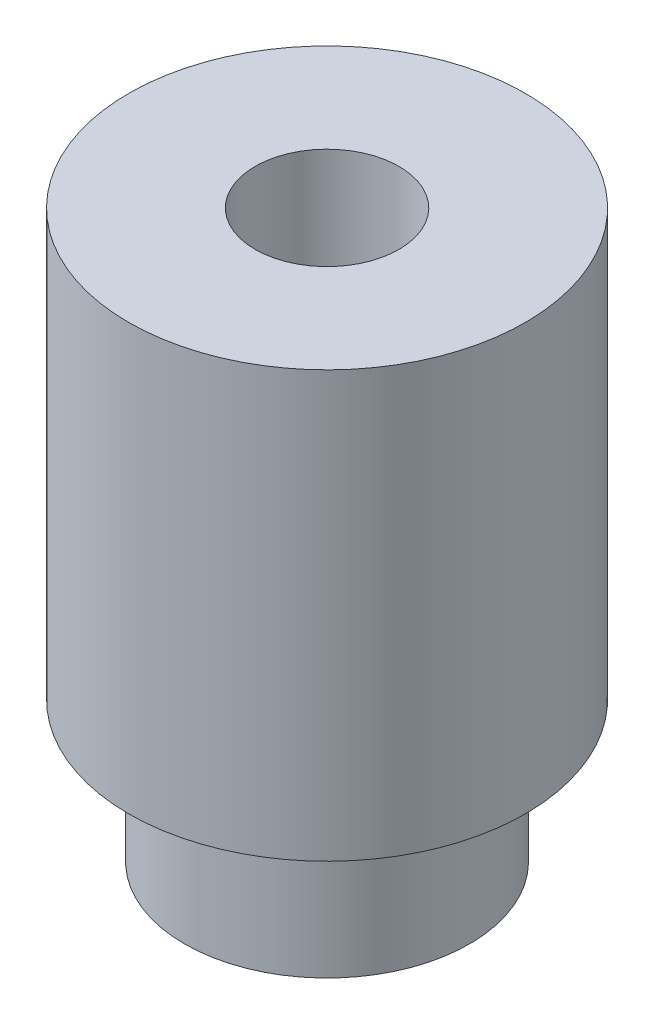
ISO-10303-21;
HEADER;
FILE_DESCRIPTION(('STEP AP214'),'2;1');
FILE_NAME('part.step','',(''),(''),'','','');
FILE_SCHEMA(('AUTOMOTIVE_DESIGN { 1 0 10303 214 1 1 1 1 }'));
ENDSEC;
DATA;
#1=APPLICATION_CONTEXT('core data for automotive mechanical design processes');
#2=APPLICATION_PROTOCOL_DEFINITION('international standard','automotive_design',2000,#1);
#3=PRODUCT_CONTEXT('',#1,'mechanical');
#4=PRODUCT('Part','Part','',(#3));
#5=PRODUCT_RELATED_PRODUCT_CATEGORY('part','',(#4));
#6=PRODUCT_DEFINITION_FORMATION('','',#4);
#7=PRODUCT_DEFINITION_CONTEXT('part definition',#1,'design');
#8=PRODUCT_DEFINITION('design','',#6,#7);
#9=PRODUCT_DEFINITION_SHAPE('','',#8);
#10=(LENGTH_UNIT() NAMED_UNIT(*) SI_UNIT(.MILLI.,.METRE.));
#11=(NAMED_UNIT(*) PLANE_ANGLE_UNIT() SI_UNIT($,.RADIAN.));
#12=(NAMED_UNIT(*) SI_UNIT($,.STERADIAN.) SOLID_ANGLE_UNIT());
#13=UNCERTAINTY_MEASURE_WITH_UNIT(LENGTH_MEASURE(1.E-05),#10,'distance_accuracy_value','');
#14=(GEOMETRIC_REPRESENTATION_CONTEXT(3) GLOBAL_UNCERTAINTY_ASSIGNED_CONTEXT((#13)) GLOBAL_UNIT_ASSIGNED_CONTEXT((#10,
#11,#12)) REPRESENTATION_CONTEXT('',''));
#15=CARTESIAN_POINT('',(0.,0.,0.));
#16=DIRECTION('',(0.,0.,1.));
#17=DIRECTION('',(1.,0.,0.));
#18=AXIS2_PLACEMENT_3D('',#15,#16,#17);
#19=CARTESIAN_POINT('',(0.,9.906,0.));
#20=DIRECTION('',(0.,-1.,0.));
#21=DIRECTION('',(0.,0.,-1.));
#22=AXIS2_PLACEMENT_3D('',#19,#20,#21);
#23=CYLINDRICAL_SURFACE('',#22,10.033);
#24=CARTESIAN_POINT('',(0.,9.906,0.));
#25=DIRECTION('',(0.,1.,0.));
#26=DIRECTION('',(0.,0.,1.));
#27=AXIS2_PLACEMENT_3D('',#24,#25,#26);
#28=CIRCLE('',#27,10.033);
#29=CARTESIAN_POINT('',(0.,9.906,10.033));
#30=VERTEX_POINT('',#29);
#31=EDGE_CURVE('E10',#30,#30,#28,.T.);
#32=ORIENTED_EDGE('',*,*,#31,.F.);
#33=EDGE_LOOP('',(#32));
#34=FACE_BOUND('',#33,.T.);
#35=CARTESIAN_POINT('',(0.,0.,0.));
#36=DIRECTION('',(0.,1.,0.));
#37=DIRECTION('',(0.,0.,1.));
#38=AXIS2_PLACEMENT_3D('',#35,#36,#37);
#39=CIRCLE('',#38,10.033);
#40=CARTESIAN_POINT('',(0.,0.,10.033));
#41=VERTEX_POINT('',#40);
#42=EDGE_CURVE('E43',#41,#41,#39,.T.);
#43=ORIENTED_EDGE('',*,*,#42,.T.);
#44=EDGE_LOOP('',(#43));
#45=FACE_BOUND('',#44,.T.);
#46=ADVANCED_FACE('F40',(#34,#45),#23,.T.);
#47=CARTESIAN_POINT('',(0.,0.,0.));
#48=DIRECTION('',(0.,1.,0.));
#49=DIRECTION('',(0.,0.,1.));
#50=AXIS2_PLACEMENT_3D('',#47,#48,#49);
#51=PLANE('',#50);
#52=CARTESIAN_POINT('',(0.,0.,0.));
#53=DIRECTION('',(0.,1.,0.));
#54=DIRECTION('',(0.,0.,1.));
#55=AXIS2_PLACEMENT_3D('',#52,#53,#54);
#56=CIRCLE('',#55,5.0673);
#57=CARTESIAN_POINT('',(0.,0.,5.0673));
#58=VERTEX_POINT('',#57);
#59=EDGE_CURVE('E55',#58,#58,#56,.T.);
#60=ORIENTED_EDGE('',*,*,#59,.T.);
#61=EDGE_LOOP('',(#60));
#62=FACE_BOUND('',#61,.T.);
#63=ORIENTED_EDGE('',*,*,#42,.F.);
#64=EDGE_LOOP('',(#63));
#65=FACE_BOUND('',#64,.T.);
#66=ADVANCED_FACE('F64',(#62,#65),#51,.F.);
#67=CARTESIAN_POINT('',(0.,39.878,0.));
#68=DIRECTION('',(0.,-1.,0.));
#69=DIRECTION('',(0.,0.,-1.));
#70=AXIS2_PLACEMENT_3D('',#67,#68,#69);
#71=CYLINDRICAL_SURFACE('',#70,13.97);
#72=CARTESIAN_POINT('',(0.,39.878,0.));
#73=DIRECTION('',(0.,1.,0.));
#74=DIRECTION('',(0.,0.,1.));
#75=AXIS2_PLACEMENT_3D('',#72,#73,#74);
#76=CIRCLE('',#75,13.97);
#77=CARTESIAN_POINT('',(0.,39.878,13.97));
#78=VERTEX_POINT('',#77);
#79=EDGE_CURVE('E50',#78,#78,#76,.T.);
#80=ORIENTED_EDGE('',*,*,#79,.F.);
#81=EDGE_LOOP('',(#80));
#82=FACE_BOUND('',#81,.T.);
#83=CARTESIAN_POINT('',(0.,9.906,0.));
#84=DIRECTION('',(0.,1.,0.));
#85=DIRECTION('',(0.,0.,1.));
#86=AXIS2_PLACEMENT_3D('',#83,#84,#85);
#87=CIRCLE('',#86,13.97);
#88=CARTESIAN_POINT('',(0.,9.906,13.97));
#89=VERTEX_POINT('',#88);
#90=EDGE_CURVE('E52',#89,#89,#87,.T.);
#91=ORIENTED_EDGE('',*,*,#90,.T.);
#92=EDGE_LOOP('',(#91));
#93=FACE_BOUND('',#92,.T.);
#94=ADVANCED_FACE('F77',(#82,#93),#71,.T.);
#95=CARTESIAN_POINT('',(0.,39.878,0.));
#96=DIRECTION('',(0.,1.,0.));
#97=DIRECTION('',(0.,0.,1.));
#98=AXIS2_PLACEMENT_3D('',#95,#96,#97);
#99=PLANE('',#98);
#100=CARTESIAN_POINT('',(0.,39.878,0.));
#101=DIRECTION('',(0.,1.,0.));
#102=DIRECTION('',(0.,0.,1.));
#103=AXIS2_PLACEMENT_3D('',#100,#101,#102);
#104=CIRCLE('',#103,5.0673);
#105=CARTESIAN_POINT('',(0.,39.878,5.0673));
#106=VERTEX_POINT('',#105);
#107=EDGE_CURVE('E58',#106,#106,#104,.T.);
#108=ORIENTED_EDGE('',*,*,#107,.F.);
#109=EDGE_LOOP('',(#108));
#110=FACE_BOUND('',#109,.T.);
#111=ORIENTED_EDGE('',*,*,#79,.T.);
#112=EDGE_LOOP('',(#111));
#113=FACE_BOUND('',#112,.T.);
#114=ADVANCED_FACE('F74',(#110,#113),#99,.T.);
#115=CARTESIAN_POINT('',(0.,9.906,0.));
#116=DIRECTION('',(0.,1.,0.));
#117=DIRECTION('',(0.,0.,1.));
#118=AXIS2_PLACEMENT_3D('',#115,#116,#117);
#119=PLANE('',#118);
#120=ORIENTED_EDGE('',*,*,#31,.T.);
#121=EDGE_LOOP('',(#120));
#122=FACE_BOUND('',#121,.T.);
#123=ORIENTED_EDGE('',*,*,#90,.F.);
#124=EDGE_LOOP('',(#123));
#125=FACE_BOUND('',#124,.T.);
#126=ADVANCED_FACE('F70',(#122,#125),#119,.F.);
#127=CARTESIAN_POINT('',(0.,0.,0.));
#128=DIRECTION('',(0.,1.,0.));
#129=DIRECTION('',(0.,0.,1.));
#130=AXIS2_PLACEMENT_3D('',#127,#128,#129);
#131=CYLINDRICAL_SURFACE('',#130,5.0673);
#132=ORIENTED_EDGE('',*,*,#59,.F.);
#133=EDGE_LOOP('',(#132));
#134=FACE_BOUND('',#133,.T.);
#135=ORIENTED_EDGE('',*,*,#107,.T.);
#136=EDGE_LOOP('',(#135));
#137=FACE_BOUND('',#136,.T.);
#138=ADVANCED_FACE('F67',(#134,#137),#131,.F.);
#139=CLOSED_SHELL('',(#46,#66,#94,#114,#126,#138));
#140=MANIFOLD_SOLID_BREP('B2',#139);
#141=ADVANCED_BREP_SHAPE_REPRESENTATION('',(#18,#140),#14);
#142=SHAPE_DEFINITION_REPRESENTATION(#9,#141);
ENDSEC;
END-ISO-10303-21;
